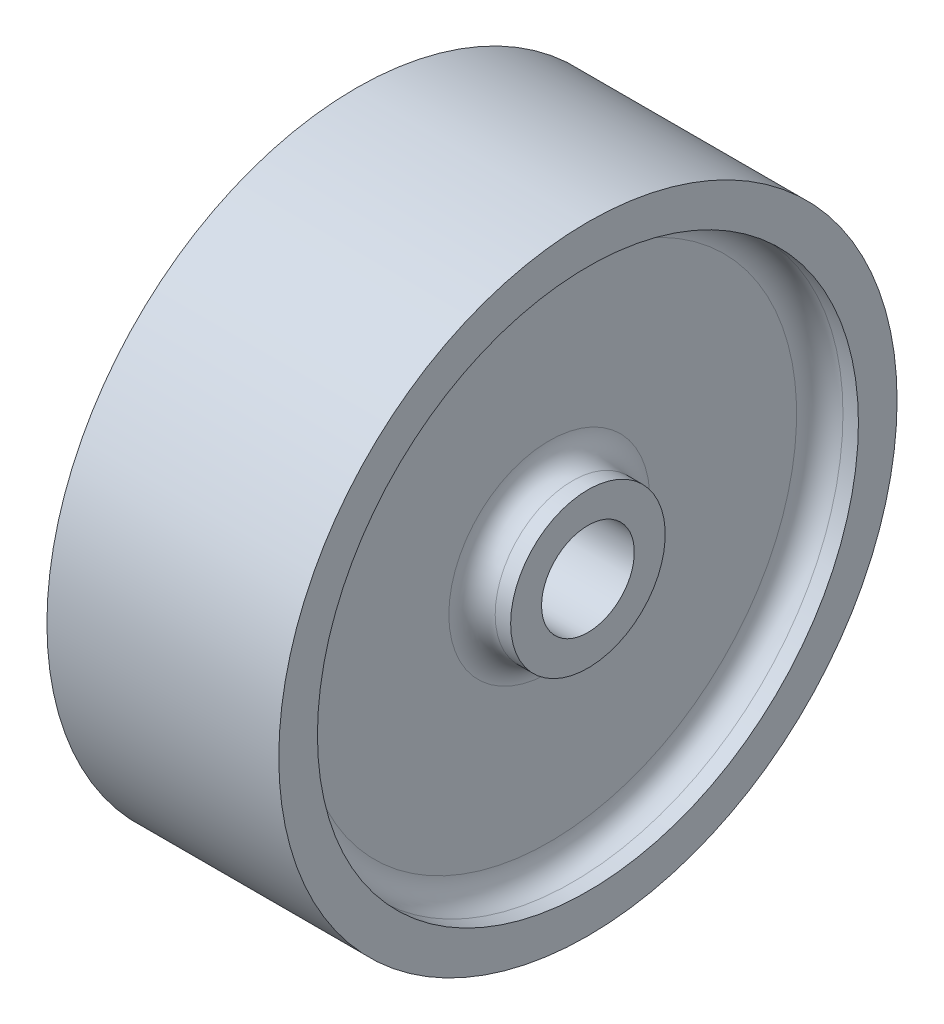
ISO-10303-21;
HEADER;
FILE_DESCRIPTION(('STEP AP214'),'2;1');
FILE_NAME('part.step','',(''),(''),'','','');
FILE_SCHEMA(('AUTOMOTIVE_DESIGN { 1 0 10303 214 1 1 1 1 }'));
ENDSEC;
DATA;
#1=APPLICATION_CONTEXT('core data for automotive mechanical design processes');
#2=APPLICATION_PROTOCOL_DEFINITION('international standard','automotive_design',2000,#1);
#3=PRODUCT_CONTEXT('',#1,'mechanical');
#4=PRODUCT('Part','Part','',(#3));
#5=PRODUCT_RELATED_PRODUCT_CATEGORY('part','',(#4));
#6=PRODUCT_DEFINITION_FORMATION('','',#4);
#7=PRODUCT_DEFINITION_CONTEXT('part definition',#1,'design');
#8=PRODUCT_DEFINITION('design','',#6,#7);
#9=PRODUCT_DEFINITION_SHAPE('','',#8);
#10=(LENGTH_UNIT() NAMED_UNIT(*) SI_UNIT(.MILLI.,.METRE.));
#11=(NAMED_UNIT(*) PLANE_ANGLE_UNIT() SI_UNIT($,.RADIAN.));
#12=(NAMED_UNIT(*) SI_UNIT($,.STERADIAN.) SOLID_ANGLE_UNIT());
#13=UNCERTAINTY_MEASURE_WITH_UNIT(LENGTH_MEASURE(1.E-05),#10,'distance_accuracy_value','');
#14=(GEOMETRIC_REPRESENTATION_CONTEXT(3) GLOBAL_UNCERTAINTY_ASSIGNED_CONTEXT((#13)) GLOBAL_UNIT_ASSIGNED_CONTEXT((#10,
#11,#12)) REPRESENTATION_CONTEXT('',''));
#15=CARTESIAN_POINT('',(0.,0.,0.));
#16=DIRECTION('',(0.,0.,1.));
#17=DIRECTION('',(1.,0.,0.));
#18=AXIS2_PLACEMENT_3D('',#15,#16,#17);
#19=CARTESIAN_POINT('',(15.,10.,0.));
#20=DIRECTION('',(-1.,0.,0.));
#21=DIRECTION('',(0.,0.,1.));
#22=AXIS2_PLACEMENT_3D('',#19,#20,#21);
#23=PLANE('',#22);
#24=CARTESIAN_POINT('',(15.,0.,0.));
#25=DIRECTION('',(-1.,0.,0.));
#26=DIRECTION('',(0.,0.,1.));
#27=AXIS2_PLACEMENT_3D('',#24,#25,#26);
#28=CIRCLE('',#27,10.);
#29=CARTESIAN_POINT('',(15.,0.,10.));
#30=VERTEX_POINT('',#29);
#31=EDGE_CURVE('E110',#30,#30,#28,.T.);
#32=ORIENTED_EDGE('',*,*,#31,.F.);
#33=EDGE_LOOP('',(#32));
#34=FACE_BOUND('',#33,.T.);
#35=CARTESIAN_POINT('',(15.,0.,0.));
#36=DIRECTION('',(-1.,0.,0.));
#37=DIRECTION('',(0.,0.,1.));
#38=AXIS2_PLACEMENT_3D('',#35,#36,#37);
#39=CIRCLE('',#38,6.);
#40=CARTESIAN_POINT('',(15.,0.,6.));
#41=VERTEX_POINT('',#40);
#42=EDGE_CURVE('E10',#41,#41,#39,.T.);
#43=ORIENTED_EDGE('',*,*,#42,.T.);
#44=EDGE_LOOP('',(#43));
#45=FACE_BOUND('',#44,.T.);
#46=ADVANCED_FACE('F43',(#34,#45),#23,.F.);
#47=CARTESIAN_POINT('',(-15.,0.,0.));
#48=DIRECTION('',(-1.,0.,0.));
#49=DIRECTION('',(0.,0.,1.));
#50=AXIS2_PLACEMENT_3D('',#47,#48,#49);
#51=CYLINDRICAL_SURFACE('',#50,6.);
#52=ORIENTED_EDGE('',*,*,#42,.F.);
#53=EDGE_LOOP('',(#52));
#54=FACE_BOUND('',#53,.T.);
#55=CARTESIAN_POINT('',(-15.,0.,0.));
#56=DIRECTION('',(-1.,0.,0.));
#57=DIRECTION('',(0.,0.,1.));
#58=AXIS2_PLACEMENT_3D('',#55,#56,#57);
#59=CIRCLE('',#58,6.);
#60=CARTESIAN_POINT('',(-15.,0.,6.));
#61=VERTEX_POINT('',#60);
#62=EDGE_CURVE('E50',#61,#61,#59,.T.);
#63=ORIENTED_EDGE('',*,*,#62,.T.);
#64=EDGE_LOOP('',(#63));
#65=FACE_BOUND('',#64,.T.);
#66=ADVANCED_FACE('F118',(#54,#65),#51,.F.);
#67=CARTESIAN_POINT('',(-15.,10.,0.));
#68=DIRECTION('',(1.,0.,0.));
#69=DIRECTION('',(0.,0.,-1.));
#70=AXIS2_PLACEMENT_3D('',#67,#68,#69);
#71=PLANE('',#70);
#72=ORIENTED_EDGE('',*,*,#62,.F.);
#73=EDGE_LOOP('',(#72));
#74=FACE_BOUND('',#73,.T.);
#75=CARTESIAN_POINT('',(-15.,0.,0.));
#76=DIRECTION('',(-1.,0.,0.));
#77=DIRECTION('',(0.,0.,1.));
#78=AXIS2_PLACEMENT_3D('',#75,#76,#77);
#79=CIRCLE('',#78,10.);
#80=CARTESIAN_POINT('',(-15.,0.,10.));
#81=VERTEX_POINT('',#80);
#82=EDGE_CURVE('E55',#81,#81,#79,.T.);
#83=ORIENTED_EDGE('',*,*,#82,.T.);
#84=EDGE_LOOP('',(#83));
#85=FACE_BOUND('',#84,.T.);
#86=ADVANCED_FACE('F122',(#74,#85),#71,.F.);
#87=CARTESIAN_POINT('',(-15.,0.,0.));
#88=DIRECTION('',(-1.,0.,0.));
#89=DIRECTION('',(0.,0.,1.));
#90=AXIS2_PLACEMENT_3D('',#87,#88,#89);
#91=CYLINDRICAL_SURFACE('',#90,10.);
#92=ORIENTED_EDGE('',*,*,#82,.F.);
#93=EDGE_LOOP('',(#92));
#94=FACE_BOUND('',#93,.T.);
#95=CARTESIAN_POINT('',(-13.,0.,0.));
#96=DIRECTION('',(-1.,0.,0.));
#97=DIRECTION('',(0.,0.,1.));
#98=AXIS2_PLACEMENT_3D('',#95,#96,#97);
#99=CIRCLE('',#98,10.);
#100=CARTESIAN_POINT('',(-13.,0.,10.));
#101=VERTEX_POINT('',#100);
#102=EDGE_CURVE('E60',#101,#101,#99,.T.);
#103=ORIENTED_EDGE('',*,*,#102,.T.);
#104=EDGE_LOOP('',(#103));
#105=FACE_BOUND('',#104,.T.);
#106=ADVANCED_FACE('F127',(#94,#105),#91,.T.);
#107=CARTESIAN_POINT('',(-13.,0.,0.));
#108=DIRECTION('',(-1.,0.,0.));
#109=DIRECTION('',(0.,0.,1.));
#110=AXIS2_PLACEMENT_3D('',#107,#108,#109);
#111=TOROIDAL_SURFACE('',#110,13.,3.);
#112=ORIENTED_EDGE('',*,*,#102,.F.);
#113=EDGE_LOOP('',(#112));
#114=FACE_BOUND('',#113,.T.);
#115=CARTESIAN_POINT('',(-10.,0.,0.));
#116=DIRECTION('',(-1.,0.,0.));
#117=DIRECTION('',(0.,0.,1.));
#118=AXIS2_PLACEMENT_3D('',#115,#116,#117);
#119=CIRCLE('',#118,13.);
#120=CARTESIAN_POINT('',(-10.,0.,13.));
#121=VERTEX_POINT('',#120);
#122=EDGE_CURVE('E66',#121,#121,#119,.T.);
#123=ORIENTED_EDGE('',*,*,#122,.T.);
#124=EDGE_LOOP('',(#123));
#125=FACE_BOUND('',#124,.T.);
#126=ADVANCED_FACE('F133',(#114,#125),#111,.F.);
#127=CARTESIAN_POINT('',(-9.99999999999999,32.,0.));
#128=DIRECTION('',(1.,0.,0.));
#129=DIRECTION('',(0.,0.,-1.));
#130=AXIS2_PLACEMENT_3D('',#127,#128,#129);
#131=PLANE('',#130);
#132=ORIENTED_EDGE('',*,*,#122,.F.);
#133=EDGE_LOOP('',(#132));
#134=FACE_BOUND('',#133,.T.);
#135=CARTESIAN_POINT('',(-9.99999999999999,0.,0.));
#136=DIRECTION('',(-1.,0.,0.));
#137=DIRECTION('',(0.,0.,1.));
#138=AXIS2_PLACEMENT_3D('',#135,#136,#137);
#139=CIRCLE('',#138,32.);
#140=CARTESIAN_POINT('',(-9.99999999999999,0.,32.));
#141=VERTEX_POINT('',#140);
#142=EDGE_CURVE('E70',#141,#141,#139,.T.);
#143=ORIENTED_EDGE('',*,*,#142,.T.);
#144=EDGE_LOOP('',(#143));
#145=FACE_BOUND('',#144,.T.);
#146=ADVANCED_FACE('F137',(#134,#145),#131,.F.);
#147=CARTESIAN_POINT('',(-13.,0.,0.));
#148=DIRECTION('',(-1.,0.,0.));
#149=DIRECTION('',(0.,0.,1.));
#150=AXIS2_PLACEMENT_3D('',#147,#148,#149);
#151=TOROIDAL_SURFACE('',#150,32.,3.);
#152=ORIENTED_EDGE('',*,*,#142,.F.);
#153=EDGE_LOOP('',(#152));
#154=FACE_BOUND('',#153,.T.);
#155=CARTESIAN_POINT('',(-13.,0.,0.));
#156=DIRECTION('',(-1.,0.,0.));
#157=DIRECTION('',(0.,0.,1.));
#158=AXIS2_PLACEMENT_3D('',#155,#156,#157);
#159=CIRCLE('',#158,35.);
#160=CARTESIAN_POINT('',(-13.,0.,35.));
#161=VERTEX_POINT('',#160);
#162=EDGE_CURVE('E74',#161,#161,#159,.T.);
#163=ORIENTED_EDGE('',*,*,#162,.T.);
#164=EDGE_LOOP('',(#163));
#165=FACE_BOUND('',#164,.T.);
#166=ADVANCED_FACE('F141',(#154,#165),#151,.F.);
#167=CARTESIAN_POINT('',(-15.,0.,0.));
#168=DIRECTION('',(-1.,0.,0.));
#169=DIRECTION('',(0.,0.,1.));
#170=AXIS2_PLACEMENT_3D('',#167,#168,#169);
#171=CYLINDRICAL_SURFACE('',#170,35.);
#172=ORIENTED_EDGE('',*,*,#162,.F.);
#173=EDGE_LOOP('',(#172));
#174=FACE_BOUND('',#173,.T.);
#175=CARTESIAN_POINT('',(-15.,0.,0.));
#176=DIRECTION('',(-1.,0.,0.));
#177=DIRECTION('',(0.,0.,1.));
#178=AXIS2_PLACEMENT_3D('',#175,#176,#177);
#179=CIRCLE('',#178,35.);
#180=CARTESIAN_POINT('',(-15.,0.,35.));
#181=VERTEX_POINT('',#180);
#182=EDGE_CURVE('E78',#181,#181,#179,.T.);
#183=ORIENTED_EDGE('',*,*,#182,.T.);
#184=EDGE_LOOP('',(#183));
#185=FACE_BOUND('',#184,.T.);
#186=ADVANCED_FACE('F145',(#174,#185),#171,.F.);
#187=CARTESIAN_POINT('',(-15.,40.,0.));
#188=DIRECTION('',(1.,0.,0.));
#189=DIRECTION('',(0.,0.,-1.));
#190=AXIS2_PLACEMENT_3D('',#187,#188,#189);
#191=PLANE('',#190);
#192=ORIENTED_EDGE('',*,*,#182,.F.);
#193=EDGE_LOOP('',(#192));
#194=FACE_BOUND('',#193,.T.);
#195=CARTESIAN_POINT('',(-15.,0.,0.));
#196=DIRECTION('',(-1.,0.,0.));
#197=DIRECTION('',(0.,0.,1.));
#198=AXIS2_PLACEMENT_3D('',#195,#196,#197);
#199=CIRCLE('',#198,40.);
#200=CARTESIAN_POINT('',(-15.,0.,40.));
#201=VERTEX_POINT('',#200);
#202=EDGE_CURVE('E82',#201,#201,#199,.T.);
#203=ORIENTED_EDGE('',*,*,#202,.T.);
#204=EDGE_LOOP('',(#203));
#205=FACE_BOUND('',#204,.T.);
#206=ADVANCED_FACE('F149',(#194,#205),#191,.F.);
#207=CARTESIAN_POINT('',(-15.,0.,0.));
#208=DIRECTION('',(-1.,0.,0.));
#209=DIRECTION('',(0.,0.,1.));
#210=AXIS2_PLACEMENT_3D('',#207,#208,#209);
#211=CYLINDRICAL_SURFACE('',#210,40.);
#212=ORIENTED_EDGE('',*,*,#202,.F.);
#213=EDGE_LOOP('',(#212));
#214=FACE_BOUND('',#213,.T.);
#215=CARTESIAN_POINT('',(15.,0.,0.));
#216=DIRECTION('',(-1.,0.,0.));
#217=DIRECTION('',(0.,0.,1.));
#218=AXIS2_PLACEMENT_3D('',#215,#216,#217);
#219=CIRCLE('',#218,40.);
#220=CARTESIAN_POINT('',(15.,0.,40.));
#221=VERTEX_POINT('',#220);
#222=EDGE_CURVE('E86',#221,#221,#219,.T.);
#223=ORIENTED_EDGE('',*,*,#222,.T.);
#224=EDGE_LOOP('',(#223));
#225=FACE_BOUND('',#224,.T.);
#226=ADVANCED_FACE('F153',(#214,#225),#211,.T.);
#227=CARTESIAN_POINT('',(15.,40.,0.));
#228=DIRECTION('',(-1.,0.,0.));
#229=DIRECTION('',(0.,0.,1.));
#230=AXIS2_PLACEMENT_3D('',#227,#228,#229);
#231=PLANE('',#230);
#232=ORIENTED_EDGE('',*,*,#222,.F.);
#233=EDGE_LOOP('',(#232));
#234=FACE_BOUND('',#233,.T.);
#235=CARTESIAN_POINT('',(15.,0.,0.));
#236=DIRECTION('',(-1.,0.,0.));
#237=DIRECTION('',(0.,0.,1.));
#238=AXIS2_PLACEMENT_3D('',#235,#236,#237);
#239=CIRCLE('',#238,35.);
#240=CARTESIAN_POINT('',(15.,0.,35.));
#241=VERTEX_POINT('',#240);
#242=EDGE_CURVE('E90',#241,#241,#239,.T.);
#243=ORIENTED_EDGE('',*,*,#242,.T.);
#244=EDGE_LOOP('',(#243));
#245=FACE_BOUND('',#244,.T.);
#246=ADVANCED_FACE('F157',(#234,#245),#231,.F.);
#247=CARTESIAN_POINT('',(-15.,0.,0.));
#248=DIRECTION('',(-1.,0.,0.));
#249=DIRECTION('',(0.,0.,1.));
#250=AXIS2_PLACEMENT_3D('',#247,#248,#249);
#251=CYLINDRICAL_SURFACE('',#250,35.);
#252=ORIENTED_EDGE('',*,*,#242,.F.);
#253=EDGE_LOOP('',(#252));
#254=FACE_BOUND('',#253,.T.);
#255=CARTESIAN_POINT('',(13.,0.,0.));
#256=DIRECTION('',(-1.,0.,0.));
#257=DIRECTION('',(0.,0.,1.));
#258=AXIS2_PLACEMENT_3D('',#255,#256,#257);
#259=CIRCLE('',#258,35.);
#260=CARTESIAN_POINT('',(13.,0.,35.));
#261=VERTEX_POINT('',#260);
#262=EDGE_CURVE('E94',#261,#261,#259,.T.);
#263=ORIENTED_EDGE('',*,*,#262,.T.);
#264=EDGE_LOOP('',(#263));
#265=FACE_BOUND('',#264,.T.);
#266=ADVANCED_FACE('F161',(#254,#265),#251,.F.);
#267=CARTESIAN_POINT('',(13.,0.,0.));
#268=DIRECTION('',(-1.,0.,0.));
#269=DIRECTION('',(0.,0.,1.));
#270=AXIS2_PLACEMENT_3D('',#267,#268,#269);
#271=TOROIDAL_SURFACE('',#270,32.,3.);
#272=ORIENTED_EDGE('',*,*,#262,.F.);
#273=EDGE_LOOP('',(#272));
#274=FACE_BOUND('',#273,.T.);
#275=CARTESIAN_POINT('',(9.99999999999999,0.,0.));
#276=DIRECTION('',(-1.,0.,0.));
#277=DIRECTION('',(0.,0.,1.));
#278=AXIS2_PLACEMENT_3D('',#275,#276,#277);
#279=CIRCLE('',#278,32.);
#280=CARTESIAN_POINT('',(9.99999999999999,0.,32.));
#281=VERTEX_POINT('',#280);
#282=EDGE_CURVE('E98',#281,#281,#279,.T.);
#283=ORIENTED_EDGE('',*,*,#282,.T.);
#284=EDGE_LOOP('',(#283));
#285=FACE_BOUND('',#284,.T.);
#286=ADVANCED_FACE('F165',(#274,#285),#271,.F.);
#287=CARTESIAN_POINT('',(10.,32.,0.));
#288=DIRECTION('',(-1.,0.,0.));
#289=DIRECTION('',(0.,0.,1.));
#290=AXIS2_PLACEMENT_3D('',#287,#288,#289);
#291=PLANE('',#290);
#292=ORIENTED_EDGE('',*,*,#282,.F.);
#293=EDGE_LOOP('',(#292));
#294=FACE_BOUND('',#293,.T.);
#295=CARTESIAN_POINT('',(10.,0.,0.));
#296=DIRECTION('',(-1.,0.,0.));
#297=DIRECTION('',(0.,0.,1.));
#298=AXIS2_PLACEMENT_3D('',#295,#296,#297);
#299=CIRCLE('',#298,13.);
#300=CARTESIAN_POINT('',(10.,0.,13.));
#301=VERTEX_POINT('',#300);
#302=EDGE_CURVE('E102',#301,#301,#299,.T.);
#303=ORIENTED_EDGE('',*,*,#302,.T.);
#304=EDGE_LOOP('',(#303));
#305=FACE_BOUND('',#304,.T.);
#306=ADVANCED_FACE('F169',(#294,#305),#291,.F.);
#307=CARTESIAN_POINT('',(13.,0.,0.));
#308=DIRECTION('',(-1.,0.,0.));
#309=DIRECTION('',(0.,0.,1.));
#310=AXIS2_PLACEMENT_3D('',#307,#308,#309);
#311=TOROIDAL_SURFACE('',#310,13.,3.);
#312=ORIENTED_EDGE('',*,*,#302,.F.);
#313=EDGE_LOOP('',(#312));
#314=FACE_BOUND('',#313,.T.);
#315=CARTESIAN_POINT('',(13.,0.,0.));
#316=DIRECTION('',(-1.,0.,0.));
#317=DIRECTION('',(0.,0.,1.));
#318=AXIS2_PLACEMENT_3D('',#315,#316,#317);
#319=CIRCLE('',#318,10.);
#320=CARTESIAN_POINT('',(13.,0.,10.));
#321=VERTEX_POINT('',#320);
#322=EDGE_CURVE('E106',#321,#321,#319,.T.);
#323=ORIENTED_EDGE('',*,*,#322,.T.);
#324=EDGE_LOOP('',(#323));
#325=FACE_BOUND('',#324,.T.);
#326=ADVANCED_FACE('F173',(#314,#325),#311,.F.);
#327=CARTESIAN_POINT('',(-15.,0.,0.));
#328=DIRECTION('',(-1.,0.,0.));
#329=DIRECTION('',(0.,0.,1.));
#330=AXIS2_PLACEMENT_3D('',#327,#328,#329);
#331=CYLINDRICAL_SURFACE('',#330,10.);
#332=ORIENTED_EDGE('',*,*,#322,.F.);
#333=EDGE_LOOP('',(#332));
#334=FACE_BOUND('',#333,.T.);
#335=ORIENTED_EDGE('',*,*,#31,.T.);
#336=EDGE_LOOP('',(#335));
#337=FACE_BOUND('',#336,.T.);
#338=ADVANCED_FACE('F115',(#334,#337),#331,.T.);
#339=CLOSED_SHELL('',(#46,#66,#86,#106,#126,#146,#166,#186,#206,#226,#246,#266,#286,#306,#326,#338));
#340=MANIFOLD_SOLID_BREP('B2',#339);
#341=ADVANCED_BREP_SHAPE_REPRESENTATION('',(#18,#340),#14);
#342=SHAPE_DEFINITION_REPRESENTATION(#9,#341);
ENDSEC;
END-ISO-10303-21;
